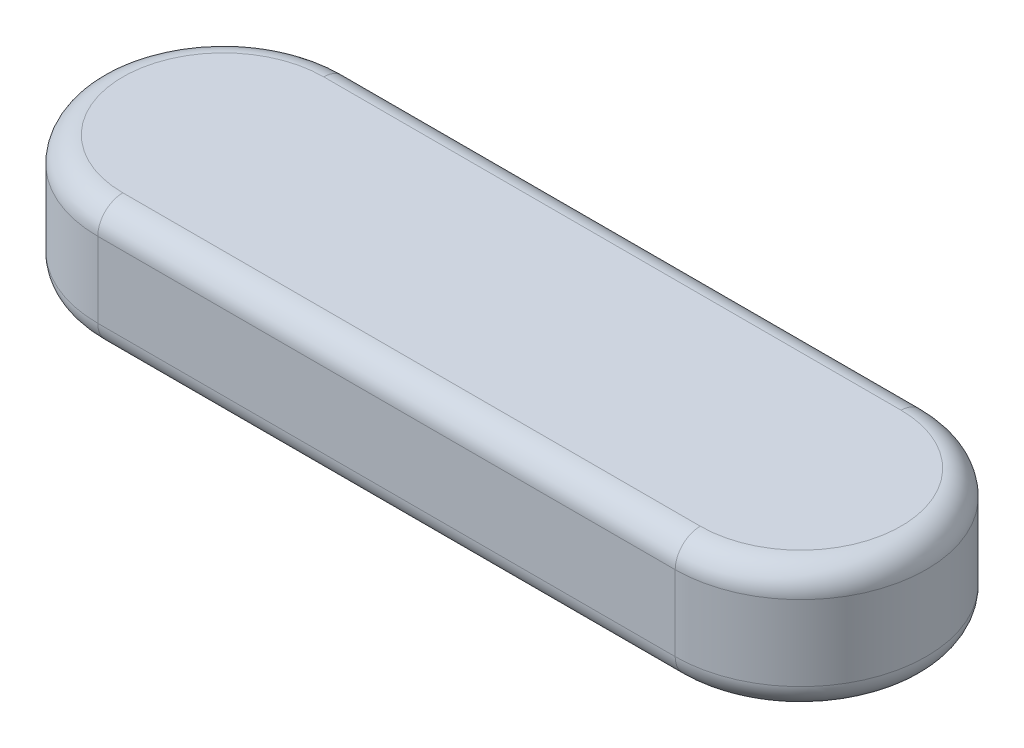
ISO-10303-21;
HEADER;
FILE_DESCRIPTION(('STEP AP214'),'2;1');
FILE_NAME('part.step','',(''),(''),'','','');
FILE_SCHEMA(('AUTOMOTIVE_DESIGN { 1 0 10303 214 1 1 1 1 }'));
ENDSEC;
DATA;
#1=APPLICATION_CONTEXT('core data for automotive mechanical design processes');
#2=APPLICATION_PROTOCOL_DEFINITION('international standard','automotive_design',2000,#1);
#3=PRODUCT_CONTEXT('',#1,'mechanical');
#4=PRODUCT('Part','Part','',(#3));
#5=PRODUCT_RELATED_PRODUCT_CATEGORY('part','',(#4));
#6=PRODUCT_DEFINITION_FORMATION('','',#4);
#7=PRODUCT_DEFINITION_CONTEXT('part definition',#1,'design');
#8=PRODUCT_DEFINITION('design','',#6,#7);
#9=PRODUCT_DEFINITION_SHAPE('','',#8);
#10=(LENGTH_UNIT() NAMED_UNIT(*) SI_UNIT(.MILLI.,.METRE.));
#11=(NAMED_UNIT(*) PLANE_ANGLE_UNIT() SI_UNIT($,.RADIAN.));
#12=(NAMED_UNIT(*) SI_UNIT($,.STERADIAN.) SOLID_ANGLE_UNIT());
#13=UNCERTAINTY_MEASURE_WITH_UNIT(LENGTH_MEASURE(1.E-05),#10,'distance_accuracy_value','');
#14=(GEOMETRIC_REPRESENTATION_CONTEXT(3) GLOBAL_UNCERTAINTY_ASSIGNED_CONTEXT((#13)) GLOBAL_UNIT_ASSIGNED_CONTEXT((#10,
#11,#12)) REPRESENTATION_CONTEXT('',''));
#15=CARTESIAN_POINT('',(0.,0.,0.));
#16=DIRECTION('',(0.,0.,1.));
#17=DIRECTION('',(1.,0.,0.));
#18=AXIS2_PLACEMENT_3D('',#15,#16,#17);
#19=CARTESIAN_POINT('',(-11.5,5.,0.));
#20=DIRECTION('',(0.,-1.,0.));
#21=DIRECTION('',(0.,0.,-1.));
#22=AXIS2_PLACEMENT_3D('',#19,#20,#21);
#23=CYLINDRICAL_SURFACE('',#22,5.);
#24=DIRECTION('',(0.,-1.,0.));
#25=VECTOR('',#24,1.);
#26=CARTESIAN_POINT('',(-11.5,5.,-5.));
#27=LINE('',#26,#25);
#28=CARTESIAN_POINT('',(-11.5,4.,-5.));
#29=VERTEX_POINT('',#28);
#30=CARTESIAN_POINT('',(-11.5,1.,-5.));
#31=VERTEX_POINT('',#30);
#32=EDGE_CURVE('E185',#29,#31,#27,.T.);
#33=ORIENTED_EDGE('',*,*,#32,.T.);
#34=CARTESIAN_POINT('',(-11.5,1.,0.));
#35=DIRECTION('',(0.,1.,0.));
#36=DIRECTION('',(0.,0.,1.));
#37=AXIS2_PLACEMENT_3D('',#34,#35,#36);
#38=CIRCLE('',#37,5.);
#39=CARTESIAN_POINT('',(-11.5,1.,5.));
#40=VERTEX_POINT('',#39);
#41=EDGE_CURVE('E131',#31,#40,#38,.T.);
#42=ORIENTED_EDGE('',*,*,#41,.T.);
#43=DIRECTION('',(0.,-1.,0.));
#44=VECTOR('',#43,1.);
#45=CARTESIAN_POINT('',(-11.5,5.,5.));
#46=LINE('',#45,#44);
#47=CARTESIAN_POINT('',(-11.5,4.,5.));
#48=VERTEX_POINT('',#47);
#49=EDGE_CURVE('E113',#48,#40,#46,.T.);
#50=ORIENTED_EDGE('',*,*,#49,.F.);
#51=CARTESIAN_POINT('',(-11.5,4.,0.));
#52=DIRECTION('',(0.,1.,0.));
#53=DIRECTION('',(0.,0.,1.));
#54=AXIS2_PLACEMENT_3D('',#51,#52,#53);
#55=CIRCLE('',#54,5.);
#56=EDGE_CURVE('E128',#48,#29,#55,.F.);
#57=ORIENTED_EDGE('',*,*,#56,.T.);
#58=EDGE_LOOP('',(#33,#42,#50,#57));
#59=FACE_BOUND('',#58,.T.);
#60=ADVANCED_FACE('F43',(#59),#23,.T.);
#61=CARTESIAN_POINT('',(-11.5,5.,5.));
#62=DIRECTION('',(0.,0.,-1.));
#63=DIRECTION('',(-1.,0.,0.));
#64=AXIS2_PLACEMENT_3D('',#61,#62,#63);
#65=PLANE('',#64);
#66=ORIENTED_EDGE('',*,*,#49,.T.);
#67=DIRECTION('',(1.,0.,0.));
#68=VECTOR('',#67,1.);
#69=CARTESIAN_POINT('',(-11.5,1.,5.));
#70=LINE('',#69,#68);
#71=CARTESIAN_POINT('',(11.5,1.,5.));
#72=VERTEX_POINT('',#71);
#73=EDGE_CURVE('E11',#40,#72,#70,.T.);
#74=ORIENTED_EDGE('',*,*,#73,.T.);
#75=DIRECTION('',(0.,-1.,0.));
#76=VECTOR('',#75,1.);
#77=CARTESIAN_POINT('',(11.5,5.,5.));
#78=LINE('',#77,#76);
#79=CARTESIAN_POINT('',(11.5,4.,5.));
#80=VERTEX_POINT('',#79);
#81=EDGE_CURVE('E115',#80,#72,#78,.T.);
#82=ORIENTED_EDGE('',*,*,#81,.F.);
#83=DIRECTION('',(1.,0.,0.));
#84=VECTOR('',#83,1.);
#85=CARTESIAN_POINT('',(-11.5,4.,5.));
#86=LINE('',#85,#84);
#87=EDGE_CURVE('E53',#80,#48,#86,.F.);
#88=ORIENTED_EDGE('',*,*,#87,.T.);
#89=EDGE_LOOP('',(#66,#74,#82,#88));
#90=FACE_BOUND('',#89,.T.);
#91=ADVANCED_FACE('F112',(#90),#65,.F.);
#92=CARTESIAN_POINT('',(11.5,5.,0.));
#93=DIRECTION('',(0.,-1.,0.));
#94=DIRECTION('',(0.,0.,-1.));
#95=AXIS2_PLACEMENT_3D('',#92,#93,#94);
#96=CYLINDRICAL_SURFACE('',#95,5.);
#97=ORIENTED_EDGE('',*,*,#81,.T.);
#98=CARTESIAN_POINT('',(11.5,1.,0.));
#99=DIRECTION('',(0.,1.,0.));
#100=DIRECTION('',(0.,0.,1.));
#101=AXIS2_PLACEMENT_3D('',#98,#99,#100);
#102=CIRCLE('',#101,5.);
#103=CARTESIAN_POINT('',(11.5,1.,-5.));
#104=VERTEX_POINT('',#103);
#105=EDGE_CURVE('E228',#72,#104,#102,.T.);
#106=ORIENTED_EDGE('',*,*,#105,.T.);
#107=DIRECTION('',(0.,-1.,0.));
#108=VECTOR('',#107,1.);
#109=CARTESIAN_POINT('',(11.5,5.,-5.));
#110=LINE('',#109,#108);
#111=CARTESIAN_POINT('',(11.5,4.,-5.));
#112=VERTEX_POINT('',#111);
#113=EDGE_CURVE('E193',#112,#104,#110,.T.);
#114=ORIENTED_EDGE('',*,*,#113,.F.);
#115=CARTESIAN_POINT('',(11.5,4.,0.));
#116=DIRECTION('',(0.,1.,0.));
#117=DIRECTION('',(0.,0.,1.));
#118=AXIS2_PLACEMENT_3D('',#115,#116,#117);
#119=CIRCLE('',#118,5.);
#120=EDGE_CURVE('E225',#112,#80,#119,.F.);
#121=ORIENTED_EDGE('',*,*,#120,.T.);
#122=EDGE_LOOP('',(#97,#106,#114,#121));
#123=FACE_BOUND('',#122,.T.);
#124=ADVANCED_FACE('F248',(#123),#96,.T.);
#125=CARTESIAN_POINT('',(-11.5,5.,-5.));
#126=DIRECTION('',(0.,0.,1.));
#127=DIRECTION('',(1.,0.,0.));
#128=AXIS2_PLACEMENT_3D('',#125,#126,#127);
#129=PLANE('',#128);
#130=ORIENTED_EDGE('',*,*,#113,.T.);
#131=DIRECTION('',(-1.,0.,0.));
#132=VECTOR('',#131,1.);
#133=CARTESIAN_POINT('',(-11.5,1.,-5.));
#134=LINE('',#133,#132);
#135=EDGE_CURVE('E222',#104,#31,#134,.T.);
#136=ORIENTED_EDGE('',*,*,#135,.T.);
#137=ORIENTED_EDGE('',*,*,#32,.F.);
#138=DIRECTION('',(-1.,0.,0.));
#139=VECTOR('',#138,1.);
#140=CARTESIAN_POINT('',(11.5,4.,-5.));
#141=LINE('',#140,#139);
#142=EDGE_CURVE('E219',#29,#112,#141,.F.);
#143=ORIENTED_EDGE('',*,*,#142,.T.);
#144=EDGE_LOOP('',(#130,#136,#137,#143));
#145=FACE_BOUND('',#144,.T.);
#146=ADVANCED_FACE('F246',(#145),#129,.F.);
#147=CARTESIAN_POINT('',(-11.5,5.,0.));
#148=DIRECTION('',(0.,1.,0.));
#149=DIRECTION('',(0.,0.,1.));
#150=AXIS2_PLACEMENT_3D('',#147,#148,#149);
#151=PLANE('',#150);
#152=DIRECTION('',(-1.,0.,0.));
#153=VECTOR('',#152,1.);
#154=CARTESIAN_POINT('',(-11.5,5.,-4.));
#155=LINE('',#154,#153);
#156=CARTESIAN_POINT('',(11.5,5.,-4.));
#157=VERTEX_POINT('',#156);
#158=CARTESIAN_POINT('',(-11.5,5.,-4.));
#159=VERTEX_POINT('',#158);
#160=EDGE_CURVE('E61',#157,#159,#155,.T.);
#161=ORIENTED_EDGE('',*,*,#160,.T.);
#162=CARTESIAN_POINT('',(-11.5,5.,0.));
#163=DIRECTION('',(0.,1.,0.));
#164=DIRECTION('',(0.,0.,1.));
#165=AXIS2_PLACEMENT_3D('',#162,#163,#164);
#166=CIRCLE('',#165,4.);
#167=CARTESIAN_POINT('',(-11.5,5.,4.));
#168=VERTEX_POINT('',#167);
#169=EDGE_CURVE('E121',#159,#168,#166,.T.);
#170=ORIENTED_EDGE('',*,*,#169,.T.);
#171=DIRECTION('',(1.,0.,0.));
#172=VECTOR('',#171,1.);
#173=CARTESIAN_POINT('',(11.5,5.,4.));
#174=LINE('',#173,#172);
#175=CARTESIAN_POINT('',(11.5,5.,4.));
#176=VERTEX_POINT('',#175);
#177=EDGE_CURVE('E144',#168,#176,#174,.T.);
#178=ORIENTED_EDGE('',*,*,#177,.T.);
#179=CARTESIAN_POINT('',(11.5,5.,0.));
#180=DIRECTION('',(0.,1.,0.));
#181=DIRECTION('',(0.,0.,1.));
#182=AXIS2_PLACEMENT_3D('',#179,#180,#181);
#183=CIRCLE('',#182,4.);
#184=EDGE_CURVE('E66',#176,#157,#183,.T.);
#185=ORIENTED_EDGE('',*,*,#184,.T.);
#186=EDGE_LOOP('',(#161,#170,#178,#185));
#187=FACE_BOUND('',#186,.T.);
#188=ADVANCED_FACE('F240',(#187),#151,.T.);
#189=CARTESIAN_POINT('',(-11.5,0.,0.));
#190=DIRECTION('',(0.,1.,0.));
#191=DIRECTION('',(0.,0.,1.));
#192=AXIS2_PLACEMENT_3D('',#189,#190,#191);
#193=PLANE('',#192);
#194=DIRECTION('',(1.,0.,0.));
#195=VECTOR('',#194,1.);
#196=CARTESIAN_POINT('',(-11.5,0.,4.));
#197=LINE('',#196,#195);
#198=CARTESIAN_POINT('',(11.5,0.,4.));
#199=VERTEX_POINT('',#198);
#200=CARTESIAN_POINT('',(-11.5,0.,4.));
#201=VERTEX_POINT('',#200);
#202=EDGE_CURVE('E206',#199,#201,#197,.F.);
#203=ORIENTED_EDGE('',*,*,#202,.T.);
#204=CARTESIAN_POINT('',(-11.5,0.,0.));
#205=DIRECTION('',(0.,1.,0.));
#206=DIRECTION('',(0.,0.,1.));
#207=AXIS2_PLACEMENT_3D('',#204,#205,#206);
#208=CIRCLE('',#207,4.);
#209=CARTESIAN_POINT('',(-11.5,0.,-4.));
#210=VERTEX_POINT('',#209);
#211=EDGE_CURVE('E215',#201,#210,#208,.F.);
#212=ORIENTED_EDGE('',*,*,#211,.T.);
#213=DIRECTION('',(-1.,0.,0.));
#214=VECTOR('',#213,1.);
#215=CARTESIAN_POINT('',(-11.5,0.,-4.));
#216=LINE('',#215,#214);
#217=CARTESIAN_POINT('',(11.5,0.,-4.));
#218=VERTEX_POINT('',#217);
#219=EDGE_CURVE('E212',#210,#218,#216,.F.);
#220=ORIENTED_EDGE('',*,*,#219,.T.);
#221=CARTESIAN_POINT('',(11.5,0.,0.));
#222=DIRECTION('',(0.,1.,0.));
#223=DIRECTION('',(0.,0.,1.));
#224=AXIS2_PLACEMENT_3D('',#221,#222,#223);
#225=CIRCLE('',#224,4.);
#226=EDGE_CURVE('E209',#218,#199,#225,.F.);
#227=ORIENTED_EDGE('',*,*,#226,.T.);
#228=EDGE_LOOP('',(#203,#212,#220,#227));
#229=FACE_BOUND('',#228,.T.);
#230=ADVANCED_FACE('F274',(#229),#193,.F.);
#231=CARTESIAN_POINT('',(11.5,1.,0.));
#232=DIRECTION('',(0.,1.,0.));
#233=DIRECTION('',(0.,0.,1.));
#234=AXIS2_PLACEMENT_3D('',#231,#232,#233);
#235=TOROIDAL_SURFACE('',#234,4.,1.);
#236=CARTESIAN_POINT('',(11.5,1.,4.));
#237=DIRECTION('',(-1.,0.,0.));
#238=DIRECTION('',(0.,0.,1.));
#239=AXIS2_PLACEMENT_3D('',#236,#237,#238);
#240=CIRCLE('',#239,1.);
#241=EDGE_CURVE('E174',#199,#72,#240,.T.);
#242=ORIENTED_EDGE('',*,*,#241,.F.);
#243=ORIENTED_EDGE('',*,*,#226,.F.);
#244=CARTESIAN_POINT('',(11.5,1.,-4.));
#245=DIRECTION('',(-1.,0.,0.));
#246=DIRECTION('',(0.,0.,1.));
#247=AXIS2_PLACEMENT_3D('',#244,#245,#246);
#248=CIRCLE('',#247,1.);
#249=EDGE_CURVE('E153',#104,#218,#248,.T.);
#250=ORIENTED_EDGE('',*,*,#249,.F.);
#251=ORIENTED_EDGE('',*,*,#105,.F.);
#252=EDGE_LOOP('',(#242,#243,#250,#251));
#253=FACE_BOUND('',#252,.T.);
#254=ADVANCED_FACE('F251',(#253),#235,.T.);
#255=CARTESIAN_POINT('',(-11.5,1.,-4.));
#256=DIRECTION('',(-1.,0.,0.));
#257=DIRECTION('',(0.,0.,1.));
#258=AXIS2_PLACEMENT_3D('',#255,#256,#257);
#259=CYLINDRICAL_SURFACE('',#258,1.);
#260=ORIENTED_EDGE('',*,*,#249,.T.);
#261=ORIENTED_EDGE('',*,*,#219,.F.);
#262=CARTESIAN_POINT('',(-11.5,1.,-4.));
#263=DIRECTION('',(-1.,0.,0.));
#264=DIRECTION('',(0.,0.,1.));
#265=AXIS2_PLACEMENT_3D('',#262,#263,#264);
#266=CIRCLE('',#265,1.);
#267=EDGE_CURVE('E165',#31,#210,#266,.T.);
#268=ORIENTED_EDGE('',*,*,#267,.F.);
#269=ORIENTED_EDGE('',*,*,#135,.F.);
#270=EDGE_LOOP('',(#260,#261,#268,#269));
#271=FACE_BOUND('',#270,.T.);
#272=ADVANCED_FACE('F253',(#271),#259,.T.);
#273=CARTESIAN_POINT('',(-11.5,1.,4.));
#274=DIRECTION('',(1.,0.,0.));
#275=DIRECTION('',(0.,0.,-1.));
#276=AXIS2_PLACEMENT_3D('',#273,#274,#275);
#277=CYLINDRICAL_SURFACE('',#276,1.);
#278=ORIENTED_EDGE('',*,*,#241,.T.);
#279=ORIENTED_EDGE('',*,*,#73,.F.);
#280=CARTESIAN_POINT('',(-11.5,1.,4.));
#281=DIRECTION('',(-1.,0.,0.));
#282=DIRECTION('',(0.,0.,1.));
#283=AXIS2_PLACEMENT_3D('',#280,#281,#282);
#284=CIRCLE('',#283,1.);
#285=EDGE_CURVE('E160',#201,#40,#284,.T.);
#286=ORIENTED_EDGE('',*,*,#285,.F.);
#287=ORIENTED_EDGE('',*,*,#202,.F.);
#288=EDGE_LOOP('',(#278,#279,#286,#287));
#289=FACE_BOUND('',#288,.T.);
#290=ADVANCED_FACE('F256',(#289),#277,.T.);
#291=CARTESIAN_POINT('',(-11.5,1.,0.));
#292=DIRECTION('',(0.,1.,0.));
#293=DIRECTION('',(0.,0.,1.));
#294=AXIS2_PLACEMENT_3D('',#291,#292,#293);
#295=TOROIDAL_SURFACE('',#294,4.,1.);
#296=ORIENTED_EDGE('',*,*,#267,.T.);
#297=ORIENTED_EDGE('',*,*,#211,.F.);
#298=ORIENTED_EDGE('',*,*,#285,.T.);
#299=ORIENTED_EDGE('',*,*,#41,.F.);
#300=EDGE_LOOP('',(#296,#297,#298,#299));
#301=FACE_BOUND('',#300,.T.);
#302=ADVANCED_FACE('F254',(#301),#295,.T.);
#303=CARTESIAN_POINT('',(11.5,4.,0.));
#304=DIRECTION('',(0.,1.,0.));
#305=DIRECTION('',(0.,0.,1.));
#306=AXIS2_PLACEMENT_3D('',#303,#304,#305);
#307=TOROIDAL_SURFACE('',#306,4.,1.);
#308=CARTESIAN_POINT('',(11.5,4.,4.));
#309=DIRECTION('',(-1.,0.,0.));
#310=DIRECTION('',(0.,0.,1.));
#311=AXIS2_PLACEMENT_3D('',#308,#309,#310);
#312=CIRCLE('',#311,1.);
#313=EDGE_CURVE('E150',#80,#176,#312,.T.);
#314=ORIENTED_EDGE('',*,*,#313,.F.);
#315=ORIENTED_EDGE('',*,*,#120,.F.);
#316=CARTESIAN_POINT('',(11.5,4.,-4.));
#317=DIRECTION('',(-1.,0.,0.));
#318=DIRECTION('',(0.,0.,1.));
#319=AXIS2_PLACEMENT_3D('',#316,#317,#318);
#320=CIRCLE('',#319,1.);
#321=EDGE_CURVE('E47',#157,#112,#320,.T.);
#322=ORIENTED_EDGE('',*,*,#321,.F.);
#323=ORIENTED_EDGE('',*,*,#184,.F.);
#324=EDGE_LOOP('',(#314,#315,#322,#323));
#325=FACE_BOUND('',#324,.T.);
#326=ADVANCED_FACE('F45',(#325),#307,.T.);
#327=CARTESIAN_POINT('',(-11.5,4.,-4.));
#328=DIRECTION('',(1.,0.,0.));
#329=DIRECTION('',(0.,0.,-1.));
#330=AXIS2_PLACEMENT_3D('',#327,#328,#329);
#331=CYLINDRICAL_SURFACE('',#330,1.);
#332=ORIENTED_EDGE('',*,*,#321,.T.);
#333=ORIENTED_EDGE('',*,*,#142,.F.);
#334=CARTESIAN_POINT('',(-11.5,4.,-4.));
#335=DIRECTION('',(-1.,0.,0.));
#336=DIRECTION('',(0.,0.,1.));
#337=AXIS2_PLACEMENT_3D('',#334,#335,#336);
#338=CIRCLE('',#337,1.);
#339=EDGE_CURVE('E139',#159,#29,#338,.T.);
#340=ORIENTED_EDGE('',*,*,#339,.F.);
#341=ORIENTED_EDGE('',*,*,#160,.F.);
#342=EDGE_LOOP('',(#332,#333,#340,#341));
#343=FACE_BOUND('',#342,.T.);
#344=ADVANCED_FACE('F243',(#343),#331,.T.);
#345=CARTESIAN_POINT('',(-11.5,4.,4.));
#346=DIRECTION('',(-1.,0.,0.));
#347=DIRECTION('',(0.,0.,1.));
#348=AXIS2_PLACEMENT_3D('',#345,#346,#347);
#349=CYLINDRICAL_SURFACE('',#348,1.);
#350=ORIENTED_EDGE('',*,*,#313,.T.);
#351=ORIENTED_EDGE('',*,*,#177,.F.);
#352=CARTESIAN_POINT('',(-11.5,4.,4.));
#353=DIRECTION('',(-1.,0.,0.));
#354=DIRECTION('',(0.,0.,1.));
#355=AXIS2_PLACEMENT_3D('',#352,#353,#354);
#356=CIRCLE('',#355,1.);
#357=EDGE_CURVE('E137',#48,#168,#356,.T.);
#358=ORIENTED_EDGE('',*,*,#357,.F.);
#359=ORIENTED_EDGE('',*,*,#87,.F.);
#360=EDGE_LOOP('',(#350,#351,#358,#359));
#361=FACE_BOUND('',#360,.T.);
#362=ADVANCED_FACE('F143',(#361),#349,.T.);
#363=CARTESIAN_POINT('',(-11.5,4.,0.));
#364=DIRECTION('',(0.,1.,0.));
#365=DIRECTION('',(0.,0.,1.));
#366=AXIS2_PLACEMENT_3D('',#363,#364,#365);
#367=TOROIDAL_SURFACE('',#366,4.,1.);
#368=ORIENTED_EDGE('',*,*,#339,.T.);
#369=ORIENTED_EDGE('',*,*,#56,.F.);
#370=ORIENTED_EDGE('',*,*,#357,.T.);
#371=ORIENTED_EDGE('',*,*,#169,.F.);
#372=EDGE_LOOP('',(#368,#369,#370,#371));
#373=FACE_BOUND('',#372,.T.);
#374=ADVANCED_FACE('F135',(#373),#367,.T.);
#375=CLOSED_SHELL('',(#60,#91,#124,#146,#188,#230,#254,#272,#290,#302,#326,#344,#362,#374));
#376=MANIFOLD_SOLID_BREP('B2',#375);
#377=ADVANCED_BREP_SHAPE_REPRESENTATION('',(#18,#376),#14);
#378=SHAPE_DEFINITION_REPRESENTATION(#9,#377);
ENDSEC;
END-ISO-10303-21;
